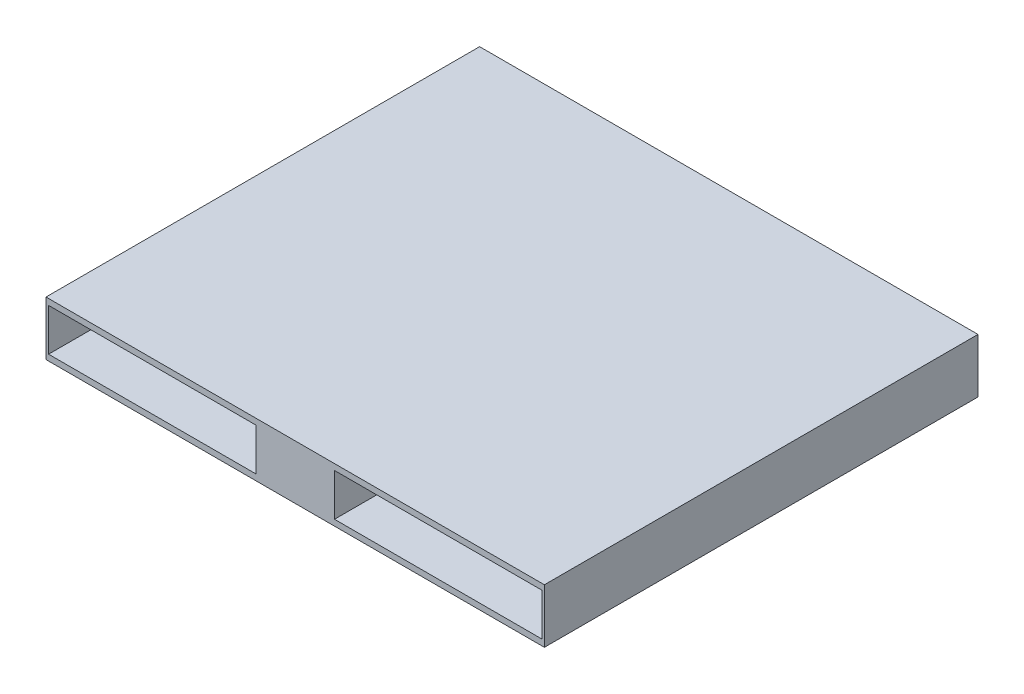
ISO-10303-21;
HEADER;
FILE_DESCRIPTION(('STEP AP214'),'2;1');
FILE_NAME('part.step','',(''),(''),'','','');
FILE_SCHEMA(('AUTOMOTIVE_DESIGN { 1 0 10303 214 1 1 1 1 }'));
ENDSEC;
DATA;
#1=APPLICATION_CONTEXT('core data for automotive mechanical design processes');
#2=APPLICATION_PROTOCOL_DEFINITION('international standard','automotive_design',2000,#1);
#3=PRODUCT_CONTEXT('',#1,'mechanical');
#4=PRODUCT('Part','Part','',(#3));
#5=PRODUCT_RELATED_PRODUCT_CATEGORY('part','',(#4));
#6=PRODUCT_DEFINITION_FORMATION('','',#4);
#7=PRODUCT_DEFINITION_CONTEXT('part definition',#1,'design');
#8=PRODUCT_DEFINITION('design','',#6,#7);
#9=PRODUCT_DEFINITION_SHAPE('','',#8);
#10=(LENGTH_UNIT() NAMED_UNIT(*) SI_UNIT(.MILLI.,.METRE.));
#11=(NAMED_UNIT(*) PLANE_ANGLE_UNIT() SI_UNIT($,.RADIAN.));
#12=(NAMED_UNIT(*) SI_UNIT($,.STERADIAN.) SOLID_ANGLE_UNIT());
#13=UNCERTAINTY_MEASURE_WITH_UNIT(LENGTH_MEASURE(1.E-05),#10,'distance_accuracy_value','');
#14=(GEOMETRIC_REPRESENTATION_CONTEXT(3) GLOBAL_UNCERTAINTY_ASSIGNED_CONTEXT((#13)) GLOBAL_UNIT_ASSIGNED_CONTEXT((#10,
#11,#12)) REPRESENTATION_CONTEXT('',''));
#15=CARTESIAN_POINT('',(0.,0.,0.));
#16=DIRECTION('',(0.,0.,1.));
#17=DIRECTION('',(1.,0.,0.));
#18=AXIS2_PLACEMENT_3D('',#15,#16,#17);
#19=CARTESIAN_POINT('',(0.,100.,0.));
#20=DIRECTION('',(0.,0.,-1.));
#21=DIRECTION('',(-1.,0.,0.));
#22=AXIS2_PLACEMENT_3D('',#19,#20,#21);
#23=PLANE('',#22);
#24=DIRECTION('',(0.,1.,0.));
#25=VECTOR('',#24,1.);
#26=CARTESIAN_POINT('',(1055.,11.000000000001,0.));
#27=LINE('',#26,#25);
#28=CARTESIAN_POINT('',(1055.,11.000000000001,0.));
#29=VERTEX_POINT('',#28);
#30=CARTESIAN_POINT('',(1055.,89.000000000001,0.));
#31=VERTEX_POINT('',#30);
#32=EDGE_CURVE('E189',#29,#31,#27,.T.);
#33=ORIENTED_EDGE('',*,*,#32,.F.);
#34=DIRECTION('',(1.,0.,0.));
#35=VECTOR('',#34,1.);
#36=CARTESIAN_POINT('',(1055.,11.000000000001,0.));
#37=LINE('',#36,#35);
#38=CARTESIAN_POINT('',(672.5,11.0000000000002,0.));
#39=VERTEX_POINT('',#38);
#40=EDGE_CURVE('E186',#39,#29,#37,.T.);
#41=ORIENTED_EDGE('',*,*,#40,.F.);
#42=DIRECTION('',(0.,-1.,0.));
#43=VECTOR('',#42,1.);
#44=CARTESIAN_POINT('',(672.5,11.0000000000002,0.));
#45=LINE('',#44,#43);
#46=CARTESIAN_POINT('',(672.5,89.0000000000002,0.));
#47=VERTEX_POINT('',#46);
#48=EDGE_CURVE('E173',#47,#39,#45,.T.);
#49=ORIENTED_EDGE('',*,*,#48,.F.);
#50=DIRECTION('',(-1.,0.,0.));
#51=VECTOR('',#50,1.);
#52=CARTESIAN_POINT('',(1055.,89.000000000001,0.));
#53=LINE('',#52,#51);
#54=EDGE_CURVE('E194',#31,#47,#53,.T.);
#55=ORIENTED_EDGE('',*,*,#54,.F.);
#56=EDGE_LOOP('',(#33,#41,#49,#55));
#57=FACE_BOUND('',#56,.T.);
#58=DIRECTION('',(1.,0.,0.));
#59=VECTOR('',#58,1.);
#60=CARTESIAN_POINT('',(145.,11.,0.));
#61=LINE('',#60,#59);
#62=CARTESIAN_POINT('',(145.,11.,0.));
#63=VERTEX_POINT('',#62);
#64=CARTESIAN_POINT('',(527.5,11.,0.));
#65=VERTEX_POINT('',#64);
#66=EDGE_CURVE('E236',#63,#65,#61,.T.);
#67=ORIENTED_EDGE('',*,*,#66,.F.);
#68=DIRECTION('',(0.,-1.,0.));
#69=VECTOR('',#68,1.);
#70=CARTESIAN_POINT('',(145.,11.,0.));
#71=LINE('',#70,#69);
#72=CARTESIAN_POINT('',(145.,89.,0.));
#73=VERTEX_POINT('',#72);
#74=EDGE_CURVE('E190',#73,#63,#71,.T.);
#75=ORIENTED_EDGE('',*,*,#74,.F.);
#76=DIRECTION('',(-1.,0.,0.));
#77=VECTOR('',#76,1.);
#78=CARTESIAN_POINT('',(145.,89.,0.));
#79=LINE('',#78,#77);
#80=CARTESIAN_POINT('',(527.5,89.,0.));
#81=VERTEX_POINT('',#80);
#82=EDGE_CURVE('E227',#81,#73,#79,.T.);
#83=ORIENTED_EDGE('',*,*,#82,.F.);
#84=DIRECTION('',(0.,1.,0.));
#85=VECTOR('',#84,1.);
#86=CARTESIAN_POINT('',(527.5,11.,0.));
#87=LINE('',#86,#85);
#88=EDGE_CURVE('E231',#65,#81,#87,.T.);
#89=ORIENTED_EDGE('',*,*,#88,.F.);
#90=EDGE_LOOP('',(#67,#75,#83,#89));
#91=FACE_BOUND('',#90,.T.);
#92=DIRECTION('',(1.,0.,0.));
#93=VECTOR('',#92,1.);
#94=CARTESIAN_POINT('',(0.,100.,0.));
#95=LINE('',#94,#93);
#96=CARTESIAN_POINT('',(140.2375,100.,0.));
#97=VERTEX_POINT('',#96);
#98=CARTESIAN_POINT('',(1059.7625,100.,0.));
#99=VERTEX_POINT('',#98);
#100=EDGE_CURVE('E54',#97,#99,#95,.T.);
#101=ORIENTED_EDGE('',*,*,#100,.F.);
#102=DIRECTION('',(0.,1.,0.));
#103=VECTOR('',#102,1.);
#104=CARTESIAN_POINT('',(140.2375,100.,0.));
#105=LINE('',#104,#103);
#106=CARTESIAN_POINT('',(140.2375,0.,0.));
#107=VERTEX_POINT('',#106);
#108=EDGE_CURVE('E137',#107,#97,#105,.T.);
#109=ORIENTED_EDGE('',*,*,#108,.F.);
#110=DIRECTION('',(1.,0.,0.));
#111=VECTOR('',#110,1.);
#112=CARTESIAN_POINT('',(0.,0.,0.));
#113=LINE('',#112,#111);
#114=CARTESIAN_POINT('',(1059.7625,0.,0.));
#115=VERTEX_POINT('',#114);
#116=EDGE_CURVE('E204',#107,#115,#113,.T.);
#117=ORIENTED_EDGE('',*,*,#116,.T.);
#118=DIRECTION('',(0.,-1.,0.));
#119=VECTOR('',#118,1.);
#120=CARTESIAN_POINT('',(1059.7625,100.,0.));
#121=LINE('',#120,#119);
#122=EDGE_CURVE('E62',#99,#115,#121,.T.);
#123=ORIENTED_EDGE('',*,*,#122,.F.);
#124=EDGE_LOOP('',(#101,#109,#117,#123));
#125=FACE_BOUND('',#124,.T.);
#126=ADVANCED_FACE('F45',(#57,#91,#125),#23,.F.);
#127=CARTESIAN_POINT('',(0.,100.,-800.));
#128=DIRECTION('',(0.,0.,1.));
#129=DIRECTION('',(1.,0.,0.));
#130=AXIS2_PLACEMENT_3D('',#127,#128,#129);
#131=PLANE('',#130);
#132=DIRECTION('',(0.,-1.,0.));
#133=VECTOR('',#132,1.);
#134=CARTESIAN_POINT('',(672.5,11.0000000000002,-800.));
#135=LINE('',#134,#133);
#136=CARTESIAN_POINT('',(672.5,89.0000000000002,-800.));
#137=VERTEX_POINT('',#136);
#138=CARTESIAN_POINT('',(672.5,11.0000000000002,-800.));
#139=VERTEX_POINT('',#138);
#140=EDGE_CURVE('E181',#137,#139,#135,.T.);
#141=ORIENTED_EDGE('',*,*,#140,.T.);
#142=DIRECTION('',(1.,0.,0.));
#143=VECTOR('',#142,1.);
#144=CARTESIAN_POINT('',(1055.,11.000000000001,-800.));
#145=LINE('',#144,#143);
#146=CARTESIAN_POINT('',(1055.,11.000000000001,-800.));
#147=VERTEX_POINT('',#146);
#148=EDGE_CURVE('E168',#139,#147,#145,.T.);
#149=ORIENTED_EDGE('',*,*,#148,.T.);
#150=DIRECTION('',(0.,1.,0.));
#151=VECTOR('',#150,1.);
#152=CARTESIAN_POINT('',(1055.,11.000000000001,-800.));
#153=LINE('',#152,#151);
#154=CARTESIAN_POINT('',(1055.,89.000000000001,-800.));
#155=VERTEX_POINT('',#154);
#156=EDGE_CURVE('E172',#147,#155,#153,.T.);
#157=ORIENTED_EDGE('',*,*,#156,.T.);
#158=DIRECTION('',(-1.,0.,0.));
#159=VECTOR('',#158,1.);
#160=CARTESIAN_POINT('',(1055.,89.000000000001,-800.));
#161=LINE('',#160,#159);
#162=EDGE_CURVE('E177',#155,#137,#161,.T.);
#163=ORIENTED_EDGE('',*,*,#162,.T.);
#164=EDGE_LOOP('',(#141,#149,#157,#163));
#165=FACE_BOUND('',#164,.T.);
#166=DIRECTION('',(-1.,0.,0.));
#167=VECTOR('',#166,1.);
#168=CARTESIAN_POINT('',(145.,89.,-800.));
#169=LINE('',#168,#167);
#170=CARTESIAN_POINT('',(527.5,89.,-800.));
#171=VERTEX_POINT('',#170);
#172=CARTESIAN_POINT('',(145.,89.,-800.));
#173=VERTEX_POINT('',#172);
#174=EDGE_CURVE('E218',#171,#173,#169,.T.);
#175=ORIENTED_EDGE('',*,*,#174,.T.);
#176=DIRECTION('',(0.,-1.,0.));
#177=VECTOR('',#176,1.);
#178=CARTESIAN_POINT('',(145.,11.,-800.));
#179=LINE('',#178,#177);
#180=CARTESIAN_POINT('',(145.,11.,-800.));
#181=VERTEX_POINT('',#180);
#182=EDGE_CURVE('E232',#173,#181,#179,.T.);
#183=ORIENTED_EDGE('',*,*,#182,.T.);
#184=DIRECTION('',(1.,0.,0.));
#185=VECTOR('',#184,1.);
#186=CARTESIAN_POINT('',(145.,11.,-800.));
#187=LINE('',#186,#185);
#188=CARTESIAN_POINT('',(527.5,11.,-800.));
#189=VERTEX_POINT('',#188);
#190=EDGE_CURVE('E249',#181,#189,#187,.T.);
#191=ORIENTED_EDGE('',*,*,#190,.T.);
#192=DIRECTION('',(0.,1.,0.));
#193=VECTOR('',#192,1.);
#194=CARTESIAN_POINT('',(527.5,11.,-800.));
#195=LINE('',#194,#193);
#196=EDGE_CURVE('E245',#189,#171,#195,.T.);
#197=ORIENTED_EDGE('',*,*,#196,.T.);
#198=EDGE_LOOP('',(#175,#183,#191,#197));
#199=FACE_BOUND('',#198,.T.);
#200=DIRECTION('',(-1.,0.,0.));
#201=VECTOR('',#200,1.);
#202=CARTESIAN_POINT('',(0.,0.,-800.));
#203=LINE('',#202,#201);
#204=CARTESIAN_POINT('',(1059.7625,0.,-800.));
#205=VERTEX_POINT('',#204);
#206=CARTESIAN_POINT('',(140.2375,0.,-800.));
#207=VERTEX_POINT('',#206);
#208=EDGE_CURVE('E48',#205,#207,#203,.T.);
#209=ORIENTED_EDGE('',*,*,#208,.T.);
#210=DIRECTION('',(0.,1.,0.));
#211=VECTOR('',#210,1.);
#212=CARTESIAN_POINT('',(140.2375,100.,-800.));
#213=LINE('',#212,#211);
#214=CARTESIAN_POINT('',(140.2375,100.,-800.));
#215=VERTEX_POINT('',#214);
#216=EDGE_CURVE('E70',#207,#215,#213,.T.);
#217=ORIENTED_EDGE('',*,*,#216,.T.);
#218=DIRECTION('',(-1.,0.,0.));
#219=VECTOR('',#218,1.);
#220=CARTESIAN_POINT('',(0.,100.,-800.));
#221=LINE('',#220,#219);
#222=CARTESIAN_POINT('',(1059.7625,100.,-800.));
#223=VERTEX_POINT('',#222);
#224=EDGE_CURVE('E11',#223,#215,#221,.T.);
#225=ORIENTED_EDGE('',*,*,#224,.F.);
#226=DIRECTION('',(0.,-1.,0.));
#227=VECTOR('',#226,1.);
#228=CARTESIAN_POINT('',(1059.7625,100.,-800.));
#229=LINE('',#228,#227);
#230=EDGE_CURVE('E157',#223,#205,#229,.T.);
#231=ORIENTED_EDGE('',*,*,#230,.T.);
#232=EDGE_LOOP('',(#209,#217,#225,#231));
#233=FACE_BOUND('',#232,.T.);
#234=ADVANCED_FACE('F148',(#165,#199,#233),#131,.F.);
#235=CARTESIAN_POINT('',(0.,100.,0.));
#236=DIRECTION('',(0.,-1.,0.));
#237=DIRECTION('',(0.,0.,-1.));
#238=AXIS2_PLACEMENT_3D('',#235,#236,#237);
#239=PLANE('',#238);
#240=ORIENTED_EDGE('',*,*,#224,.T.);
#241=DIRECTION('',(0.,0.,1.));
#242=VECTOR('',#241,1.);
#243=CARTESIAN_POINT('',(140.2375,100.,-800.));
#244=LINE('',#243,#242);
#245=EDGE_CURVE('E134',#215,#97,#244,.T.);
#246=ORIENTED_EDGE('',*,*,#245,.T.);
#247=ORIENTED_EDGE('',*,*,#100,.T.);
#248=DIRECTION('',(0.,0.,1.));
#249=VECTOR('',#248,1.);
#250=CARTESIAN_POINT('',(1059.7625,100.,-800.));
#251=LINE('',#250,#249);
#252=EDGE_CURVE('E155',#223,#99,#251,.T.);
#253=ORIENTED_EDGE('',*,*,#252,.F.);
#254=EDGE_LOOP('',(#240,#246,#247,#253));
#255=FACE_BOUND('',#254,.T.);
#256=ADVANCED_FACE('F154',(#255),#239,.F.);
#257=CARTESIAN_POINT('',(0.,0.,0.));
#258=DIRECTION('',(0.,-1.,0.));
#259=DIRECTION('',(0.,0.,-1.));
#260=AXIS2_PLACEMENT_3D('',#257,#258,#259);
#261=PLANE('',#260);
#262=DIRECTION('',(0.,0.,1.));
#263=VECTOR('',#262,1.);
#264=CARTESIAN_POINT('',(140.2375,0.,-800.));
#265=LINE('',#264,#263);
#266=EDGE_CURVE('E143',#207,#107,#265,.T.);
#267=ORIENTED_EDGE('',*,*,#266,.F.);
#268=ORIENTED_EDGE('',*,*,#208,.F.);
#269=DIRECTION('',(0.,0.,1.));
#270=VECTOR('',#269,1.);
#271=CARTESIAN_POINT('',(1059.7625,0.,-800.));
#272=LINE('',#271,#270);
#273=EDGE_CURVE('E158',#205,#115,#272,.T.);
#274=ORIENTED_EDGE('',*,*,#273,.T.);
#275=ORIENTED_EDGE('',*,*,#116,.F.);
#276=EDGE_LOOP('',(#267,#268,#274,#275));
#277=FACE_BOUND('',#276,.T.);
#278=ADVANCED_FACE('F263',(#277),#261,.T.);
#279=CARTESIAN_POINT('',(145.,11.,-800.));
#280=DIRECTION('',(-1.,0.,0.));
#281=DIRECTION('',(0.,0.,1.));
#282=AXIS2_PLACEMENT_3D('',#279,#280,#281);
#283=PLANE('',#282);
#284=ORIENTED_EDGE('',*,*,#74,.T.);
#285=DIRECTION('',(0.,0.,1.));
#286=VECTOR('',#285,1.);
#287=CARTESIAN_POINT('',(145.,11.,-800.));
#288=LINE('',#287,#286);
#289=EDGE_CURVE('E214',#181,#63,#288,.T.);
#290=ORIENTED_EDGE('',*,*,#289,.F.);
#291=ORIENTED_EDGE('',*,*,#182,.F.);
#292=DIRECTION('',(0.,0.,1.));
#293=VECTOR('',#292,1.);
#294=CARTESIAN_POINT('',(145.,89.,-800.));
#295=LINE('',#294,#293);
#296=EDGE_CURVE('E142',#173,#73,#295,.T.);
#297=ORIENTED_EDGE('',*,*,#296,.T.);
#298=EDGE_LOOP('',(#284,#290,#291,#297));
#299=FACE_BOUND('',#298,.T.);
#300=ADVANCED_FACE('F298',(#299),#283,.F.);
#301=CARTESIAN_POINT('',(145.,89.,-800.));
#302=DIRECTION('',(0.,1.,0.));
#303=DIRECTION('',(0.,0.,1.));
#304=AXIS2_PLACEMENT_3D('',#301,#302,#303);
#305=PLANE('',#304);
#306=ORIENTED_EDGE('',*,*,#82,.T.);
#307=ORIENTED_EDGE('',*,*,#296,.F.);
#308=ORIENTED_EDGE('',*,*,#174,.F.);
#309=DIRECTION('',(0.,0.,1.));
#310=VECTOR('',#309,1.);
#311=CARTESIAN_POINT('',(527.5,89.,-800.));
#312=LINE('',#311,#310);
#313=EDGE_CURVE('E222',#171,#81,#312,.T.);
#314=ORIENTED_EDGE('',*,*,#313,.T.);
#315=EDGE_LOOP('',(#306,#307,#308,#314));
#316=FACE_BOUND('',#315,.T.);
#317=ADVANCED_FACE('F301',(#316),#305,.F.);
#318=CARTESIAN_POINT('',(527.5,11.,-800.));
#319=DIRECTION('',(1.,0.,0.));
#320=DIRECTION('',(0.,1.,0.));
#321=AXIS2_PLACEMENT_3D('',#318,#319,#320);
#322=PLANE('',#321);
#323=ORIENTED_EDGE('',*,*,#88,.T.);
#324=ORIENTED_EDGE('',*,*,#313,.F.);
#325=ORIENTED_EDGE('',*,*,#196,.F.);
#326=DIRECTION('',(0.,0.,1.));
#327=VECTOR('',#326,1.);
#328=CARTESIAN_POINT('',(527.5,11.,-800.));
#329=LINE('',#328,#327);
#330=EDGE_CURVE('E219',#189,#65,#329,.T.);
#331=ORIENTED_EDGE('',*,*,#330,.T.);
#332=EDGE_LOOP('',(#323,#324,#325,#331));
#333=FACE_BOUND('',#332,.T.);
#334=ADVANCED_FACE('F303',(#333),#322,.F.);
#335=CARTESIAN_POINT('',(145.,11.,-800.));
#336=DIRECTION('',(0.,-1.,0.));
#337=DIRECTION('',(1.,0.,0.));
#338=AXIS2_PLACEMENT_3D('',#335,#336,#337);
#339=PLANE('',#338);
#340=ORIENTED_EDGE('',*,*,#66,.T.);
#341=ORIENTED_EDGE('',*,*,#330,.F.);
#342=ORIENTED_EDGE('',*,*,#190,.F.);
#343=ORIENTED_EDGE('',*,*,#289,.T.);
#344=EDGE_LOOP('',(#340,#341,#342,#343));
#345=FACE_BOUND('',#344,.T.);
#346=ADVANCED_FACE('F294',(#345),#339,.F.);
#347=CARTESIAN_POINT('',(1055.,11.000000000001,-800.));
#348=DIRECTION('',(0.,-1.,0.));
#349=DIRECTION('',(1.,0.,0.));
#350=AXIS2_PLACEMENT_3D('',#347,#348,#349);
#351=PLANE('',#350);
#352=ORIENTED_EDGE('',*,*,#40,.T.);
#353=DIRECTION('',(0.,0.,1.));
#354=VECTOR('',#353,1.);
#355=CARTESIAN_POINT('',(1055.,11.000000000001,-800.));
#356=LINE('',#355,#354);
#357=EDGE_CURVE('E185',#147,#29,#356,.T.);
#358=ORIENTED_EDGE('',*,*,#357,.F.);
#359=ORIENTED_EDGE('',*,*,#148,.F.);
#360=DIRECTION('',(0.,0.,1.));
#361=VECTOR('',#360,1.);
#362=CARTESIAN_POINT('',(672.5,11.0000000000002,-800.));
#363=LINE('',#362,#361);
#364=EDGE_CURVE('E201',#139,#39,#363,.T.);
#365=ORIENTED_EDGE('',*,*,#364,.T.);
#366=EDGE_LOOP('',(#352,#358,#359,#365));
#367=FACE_BOUND('',#366,.T.);
#368=ADVANCED_FACE('F311',(#367),#351,.F.);
#369=CARTESIAN_POINT('',(672.5,11.0000000000002,-800.));
#370=DIRECTION('',(-1.,0.,0.));
#371=DIRECTION('',(0.,-1.,0.));
#372=AXIS2_PLACEMENT_3D('',#369,#370,#371);
#373=PLANE('',#372);
#374=ORIENTED_EDGE('',*,*,#48,.T.);
#375=ORIENTED_EDGE('',*,*,#364,.F.);
#376=ORIENTED_EDGE('',*,*,#140,.F.);
#377=DIRECTION('',(0.,0.,1.));
#378=VECTOR('',#377,1.);
#379=CARTESIAN_POINT('',(672.5,89.0000000000002,-800.));
#380=LINE('',#379,#378);
#381=EDGE_CURVE('E205',#137,#47,#380,.T.);
#382=ORIENTED_EDGE('',*,*,#381,.T.);
#383=EDGE_LOOP('',(#374,#375,#376,#382));
#384=FACE_BOUND('',#383,.T.);
#385=ADVANCED_FACE('F325',(#384),#373,.F.);
#386=CARTESIAN_POINT('',(1055.,89.000000000001,-800.));
#387=DIRECTION('',(0.,1.,0.));
#388=DIRECTION('',(-1.,0.,0.));
#389=AXIS2_PLACEMENT_3D('',#386,#387,#388);
#390=PLANE('',#389);
#391=ORIENTED_EDGE('',*,*,#54,.T.);
#392=ORIENTED_EDGE('',*,*,#381,.F.);
#393=ORIENTED_EDGE('',*,*,#162,.F.);
#394=DIRECTION('',(0.,0.,1.));
#395=VECTOR('',#394,1.);
#396=CARTESIAN_POINT('',(1055.,89.000000000001,-800.));
#397=LINE('',#396,#395);
#398=EDGE_CURVE('E208',#155,#31,#397,.T.);
#399=ORIENTED_EDGE('',*,*,#398,.T.);
#400=EDGE_LOOP('',(#391,#392,#393,#399));
#401=FACE_BOUND('',#400,.T.);
#402=ADVANCED_FACE('F274',(#401),#390,.F.);
#403=CARTESIAN_POINT('',(1055.,11.000000000001,-800.));
#404=DIRECTION('',(1.,0.,0.));
#405=DIRECTION('',(0.,1.,0.));
#406=AXIS2_PLACEMENT_3D('',#403,#404,#405);
#407=PLANE('',#406);
#408=ORIENTED_EDGE('',*,*,#32,.T.);
#409=ORIENTED_EDGE('',*,*,#398,.F.);
#410=ORIENTED_EDGE('',*,*,#156,.F.);
#411=ORIENTED_EDGE('',*,*,#357,.T.);
#412=EDGE_LOOP('',(#408,#409,#410,#411));
#413=FACE_BOUND('',#412,.T.);
#414=ADVANCED_FACE('F266',(#413),#407,.F.);
#415=CARTESIAN_POINT('',(1059.7625,100.,-800.));
#416=DIRECTION('',(-1.,0.,0.));
#417=DIRECTION('',(0.,0.,1.));
#418=AXIS2_PLACEMENT_3D('',#415,#416,#417);
#419=PLANE('',#418);
#420=ORIENTED_EDGE('',*,*,#122,.T.);
#421=ORIENTED_EDGE('',*,*,#273,.F.);
#422=ORIENTED_EDGE('',*,*,#230,.F.);
#423=ORIENTED_EDGE('',*,*,#252,.T.);
#424=EDGE_LOOP('',(#420,#421,#422,#423));
#425=FACE_BOUND('',#424,.T.);
#426=ADVANCED_FACE('F264',(#425),#419,.F.);
#427=CARTESIAN_POINT('',(140.2375,100.,-800.));
#428=DIRECTION('',(1.,0.,0.));
#429=DIRECTION('',(0.,0.,-1.));
#430=AXIS2_PLACEMENT_3D('',#427,#428,#429);
#431=PLANE('',#430);
#432=ORIENTED_EDGE('',*,*,#108,.T.);
#433=ORIENTED_EDGE('',*,*,#245,.F.);
#434=ORIENTED_EDGE('',*,*,#216,.F.);
#435=ORIENTED_EDGE('',*,*,#266,.T.);
#436=EDGE_LOOP('',(#432,#433,#434,#435));
#437=FACE_BOUND('',#436,.T.);
#438=ADVANCED_FACE('F135',(#437),#431,.F.);
#439=CLOSED_SHELL('',(#126,#234,#256,#278,#300,#317,#334,#346,#368,#385,#402,#414,#426,#438));
#440=MANIFOLD_SOLID_BREP('B2',#439);
#441=ADVANCED_BREP_SHAPE_REPRESENTATION('',(#18,#440),#14);
#442=SHAPE_DEFINITION_REPRESENTATION(#9,#441);
ENDSEC;
END-ISO-10303-21;
